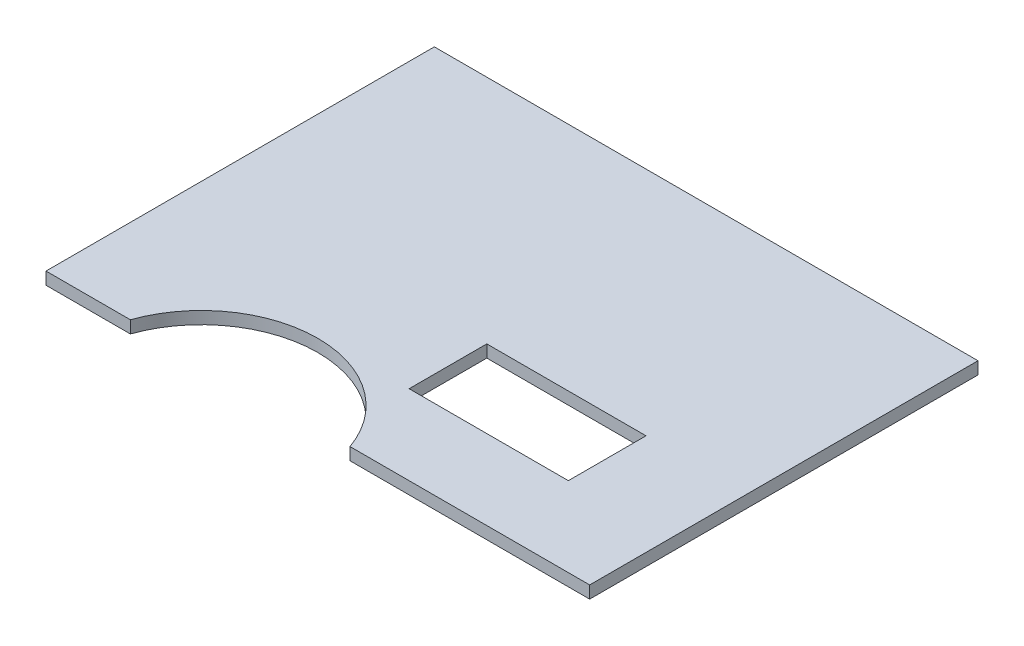
ISO-10303-21;
HEADER;
FILE_DESCRIPTION(('STEP AP214'),'2;1');
FILE_NAME('part.step','',(''),(''),'','','');
FILE_SCHEMA(('AUTOMOTIVE_DESIGN { 1 0 10303 214 1 1 1 1 }'));
ENDSEC;
DATA;
#1=APPLICATION_CONTEXT('core data for automotive mechanical design processes');
#2=APPLICATION_PROTOCOL_DEFINITION('international standard','automotive_design',2000,#1);
#3=PRODUCT_CONTEXT('',#1,'mechanical');
#4=PRODUCT('Part','Part','',(#3));
#5=PRODUCT_RELATED_PRODUCT_CATEGORY('part','',(#4));
#6=PRODUCT_DEFINITION_FORMATION('','',#4);
#7=PRODUCT_DEFINITION_CONTEXT('part definition',#1,'design');
#8=PRODUCT_DEFINITION('design','',#6,#7);
#9=PRODUCT_DEFINITION_SHAPE('','',#8);
#10=(LENGTH_UNIT() NAMED_UNIT(*) SI_UNIT(.MILLI.,.METRE.));
#11=(NAMED_UNIT(*) PLANE_ANGLE_UNIT() SI_UNIT($,.RADIAN.));
#12=(NAMED_UNIT(*) SI_UNIT($,.STERADIAN.) SOLID_ANGLE_UNIT());
#13=UNCERTAINTY_MEASURE_WITH_UNIT(LENGTH_MEASURE(1.E-05),#10,'distance_accuracy_value','');
#14=(GEOMETRIC_REPRESENTATION_CONTEXT(3) GLOBAL_UNCERTAINTY_ASSIGNED_CONTEXT((#13)) GLOBAL_UNIT_ASSIGNED_CONTEXT((#10,
#11,#12)) REPRESENTATION_CONTEXT('',''));
#15=CARTESIAN_POINT('',(0.,0.,0.));
#16=DIRECTION('',(0.,0.,1.));
#17=DIRECTION('',(1.,0.,0.));
#18=AXIS2_PLACEMENT_3D('',#15,#16,#17);
#19=CARTESIAN_POINT('',(0.,3.175,0.));
#20=DIRECTION('',(0.,0.,-1.));
#21=DIRECTION('',(-1.,0.,0.));
#22=AXIS2_PLACEMENT_3D('',#19,#20,#21);
#23=PLANE('',#22);
#24=DIRECTION('',(1.,0.,0.));
#25=VECTOR('',#24,1.);
#26=CARTESIAN_POINT('',(0.,0.,0.));
#27=LINE('',#26,#25);
#28=CARTESIAN_POINT('',(0.,0.,0.));
#29=VERTEX_POINT('',#28);
#30=CARTESIAN_POINT('',(21.7157287525381,0.,0.));
#31=VERTEX_POINT('',#30);
#32=EDGE_CURVE('E144',#29,#31,#27,.T.);
#33=ORIENTED_EDGE('',*,*,#32,.T.);
#34=DIRECTION('',(0.,1.,0.));
#35=VECTOR('',#34,1.);
#36=CARTESIAN_POINT('',(21.7157287525381,-6.825,0.));
#37=LINE('',#36,#35);
#38=CARTESIAN_POINT('',(21.7157287525381,3.175,0.));
#39=VERTEX_POINT('',#38);
#40=EDGE_CURVE('E47',#31,#39,#37,.T.);
#41=ORIENTED_EDGE('',*,*,#40,.T.);
#42=DIRECTION('',(1.,0.,0.));
#43=VECTOR('',#42,1.);
#44=CARTESIAN_POINT('',(0.,3.175,0.));
#45=LINE('',#44,#43);
#46=CARTESIAN_POINT('',(0.,3.175,0.));
#47=VERTEX_POINT('',#46);
#48=EDGE_CURVE('E122',#47,#39,#45,.T.);
#49=ORIENTED_EDGE('',*,*,#48,.F.);
#50=DIRECTION('',(0.,-1.,0.));
#51=VECTOR('',#50,1.);
#52=CARTESIAN_POINT('',(0.,3.175,0.));
#53=LINE('',#52,#51);
#54=EDGE_CURVE('E156',#47,#29,#53,.T.);
#55=ORIENTED_EDGE('',*,*,#54,.T.);
#56=EDGE_LOOP('',(#33,#41,#49,#55));
#57=FACE_BOUND('',#56,.T.);
#58=ADVANCED_FACE('F33',(#57),#23,.F.);
#59=CARTESIAN_POINT('',(0.,3.175,0.));
#60=DIRECTION('',(1.,0.,0.));
#61=DIRECTION('',(0.,0.,-1.));
#62=AXIS2_PLACEMENT_3D('',#59,#60,#61);
#63=PLANE('',#62);
#64=DIRECTION('',(0.,0.,1.));
#65=VECTOR('',#64,1.);
#66=CARTESIAN_POINT('',(0.,0.,0.));
#67=LINE('',#66,#65);
#68=CARTESIAN_POINT('',(0.,0.,-100.));
#69=VERTEX_POINT('',#68);
#70=EDGE_CURVE('E139',#69,#29,#67,.T.);
#71=ORIENTED_EDGE('',*,*,#70,.T.);
#72=ORIENTED_EDGE('',*,*,#54,.F.);
#73=DIRECTION('',(0.,0.,1.));
#74=VECTOR('',#73,1.);
#75=CARTESIAN_POINT('',(0.,3.175,0.));
#76=LINE('',#75,#74);
#77=CARTESIAN_POINT('',(0.,3.175,-100.));
#78=VERTEX_POINT('',#77);
#79=EDGE_CURVE('E128',#78,#47,#76,.T.);
#80=ORIENTED_EDGE('',*,*,#79,.F.);
#81=DIRECTION('',(0.,-1.,0.));
#82=VECTOR('',#81,1.);
#83=CARTESIAN_POINT('',(0.,3.175,-100.));
#84=LINE('',#83,#82);
#85=EDGE_CURVE('E138',#78,#69,#84,.T.);
#86=ORIENTED_EDGE('',*,*,#85,.T.);
#87=EDGE_LOOP('',(#71,#72,#80,#86));
#88=FACE_BOUND('',#87,.T.);
#89=ADVANCED_FACE('F35',(#88),#63,.F.);
#90=CARTESIAN_POINT('',(78.2842712474619,3.175,0.));
#91=VERTEX_POINT('',#90);
#92=CARTESIAN_POINT('',(140.,3.175,0.));
#93=VERTEX_POINT('',#92);
#94=EDGE_CURVE('E119',#91,#93,#45,.T.);
#95=ORIENTED_EDGE('',*,*,#94,.F.);
#96=DIRECTION('',(0.,1.,0.));
#97=VECTOR('',#96,1.);
#98=CARTESIAN_POINT('',(78.2842712474619,-6.825,0.));
#99=LINE('',#98,#97);
#100=CARTESIAN_POINT('',(78.2842712474619,0.,0.));
#101=VERTEX_POINT('',#100);
#102=EDGE_CURVE('E108',#91,#101,#99,.F.);
#103=ORIENTED_EDGE('',*,*,#102,.T.);
#104=CARTESIAN_POINT('',(140.,0.,0.));
#105=VERTEX_POINT('',#104);
#106=EDGE_CURVE('E142',#101,#105,#27,.T.);
#107=ORIENTED_EDGE('',*,*,#106,.T.);
#108=DIRECTION('',(0.,-1.,0.));
#109=VECTOR('',#108,1.);
#110=CARTESIAN_POINT('',(140.,3.175,0.));
#111=LINE('',#110,#109);
#112=EDGE_CURVE('E126',#93,#105,#111,.T.);
#113=ORIENTED_EDGE('',*,*,#112,.F.);
#114=EDGE_LOOP('',(#95,#103,#107,#113));
#115=FACE_BOUND('',#114,.T.);
#116=ADVANCED_FACE('F124',(#115),#23,.F.);
#117=CARTESIAN_POINT('',(140.,3.175,0.));
#118=DIRECTION('',(-1.,0.,0.));
#119=DIRECTION('',(0.,0.,1.));
#120=AXIS2_PLACEMENT_3D('',#117,#118,#119);
#121=PLANE('',#120);
#122=DIRECTION('',(0.,0.,-1.));
#123=VECTOR('',#122,1.);
#124=CARTESIAN_POINT('',(140.,0.,0.));
#125=LINE('',#124,#123);
#126=CARTESIAN_POINT('',(140.,0.,-100.));
#127=VERTEX_POINT('',#126);
#128=EDGE_CURVE('E147',#105,#127,#125,.T.);
#129=ORIENTED_EDGE('',*,*,#128,.T.);
#130=DIRECTION('',(0.,-1.,0.));
#131=VECTOR('',#130,1.);
#132=CARTESIAN_POINT('',(140.,3.175,-100.));
#133=LINE('',#132,#131);
#134=CARTESIAN_POINT('',(140.,3.175,-100.));
#135=VERTEX_POINT('',#134);
#136=EDGE_CURVE('E152',#135,#127,#133,.T.);
#137=ORIENTED_EDGE('',*,*,#136,.F.);
#138=DIRECTION('',(0.,0.,-1.));
#139=VECTOR('',#138,1.);
#140=CARTESIAN_POINT('',(140.,3.175,0.));
#141=LINE('',#140,#139);
#142=EDGE_CURVE('E130',#93,#135,#141,.T.);
#143=ORIENTED_EDGE('',*,*,#142,.F.);
#144=ORIENTED_EDGE('',*,*,#112,.T.);
#145=EDGE_LOOP('',(#129,#137,#143,#144));
#146=FACE_BOUND('',#145,.T.);
#147=ADVANCED_FACE('F206',(#146),#121,.F.);
#148=CARTESIAN_POINT('',(0.,3.175,-100.));
#149=DIRECTION('',(0.,0.,1.));
#150=DIRECTION('',(1.,0.,0.));
#151=AXIS2_PLACEMENT_3D('',#148,#149,#150);
#152=PLANE('',#151);
#153=DIRECTION('',(-1.,0.,0.));
#154=VECTOR('',#153,1.);
#155=CARTESIAN_POINT('',(0.,0.,-100.));
#156=LINE('',#155,#154);
#157=EDGE_CURVE('E131',#127,#69,#156,.T.);
#158=ORIENTED_EDGE('',*,*,#157,.T.);
#159=ORIENTED_EDGE('',*,*,#85,.F.);
#160=DIRECTION('',(-1.,0.,0.));
#161=VECTOR('',#160,1.);
#162=CARTESIAN_POINT('',(0.,3.175,-100.));
#163=LINE('',#162,#161);
#164=EDGE_CURVE('E136',#135,#78,#163,.T.);
#165=ORIENTED_EDGE('',*,*,#164,.F.);
#166=ORIENTED_EDGE('',*,*,#136,.T.);
#167=EDGE_LOOP('',(#158,#159,#165,#166));
#168=FACE_BOUND('',#167,.T.);
#169=ADVANCED_FACE('F212',(#168),#152,.F.);
#170=CARTESIAN_POINT('',(0.,3.175,0.));
#171=DIRECTION('',(0.,-1.,0.));
#172=DIRECTION('',(0.,0.,-1.));
#173=AXIS2_PLACEMENT_3D('',#170,#171,#172);
#174=PLANE('',#173);
#175=DIRECTION('',(1.,0.,0.));
#176=VECTOR('',#175,1.);
#177=CARTESIAN_POINT('',(73.,3.175,-20.51));
#178=LINE('',#177,#176);
#179=CARTESIAN_POINT('',(73.,3.175,-20.51));
#180=VERTEX_POINT('',#179);
#181=CARTESIAN_POINT('',(114.,3.175,-20.51));
#182=VERTEX_POINT('',#181);
#183=EDGE_CURVE('E194',#180,#182,#178,.T.);
#184=ORIENTED_EDGE('',*,*,#183,.F.);
#185=DIRECTION('',(0.,0.,1.));
#186=VECTOR('',#185,1.);
#187=CARTESIAN_POINT('',(73.,3.175,-40.51));
#188=LINE('',#187,#186);
#189=CARTESIAN_POINT('',(73.,3.175,-40.51));
#190=VERTEX_POINT('',#189);
#191=EDGE_CURVE('E55',#190,#180,#188,.T.);
#192=ORIENTED_EDGE('',*,*,#191,.F.);
#193=DIRECTION('',(-1.,0.,0.));
#194=VECTOR('',#193,1.);
#195=CARTESIAN_POINT('',(73.,3.175,-40.51));
#196=LINE('',#195,#194);
#197=CARTESIAN_POINT('',(114.,3.175,-40.51));
#198=VERTEX_POINT('',#197);
#199=EDGE_CURVE('E177',#198,#190,#196,.T.);
#200=ORIENTED_EDGE('',*,*,#199,.F.);
#201=DIRECTION('',(0.,0.,-1.));
#202=VECTOR('',#201,1.);
#203=CARTESIAN_POINT('',(114.,3.175,-40.51));
#204=LINE('',#203,#202);
#205=EDGE_CURVE('E188',#182,#198,#204,.T.);
#206=ORIENTED_EDGE('',*,*,#205,.F.);
#207=EDGE_LOOP('',(#184,#192,#200,#206));
#208=FACE_BOUND('',#207,.T.);
#209=ORIENTED_EDGE('',*,*,#48,.T.);
#210=CARTESIAN_POINT('',(50.,3.175,9.99999999999999));
#211=DIRECTION('',(0.,1.,0.));
#212=DIRECTION('',(0.,0.,1.));
#213=AXIS2_PLACEMENT_3D('',#210,#211,#212);
#214=CIRCLE('',#213,30.);
#215=EDGE_CURVE('E111',#91,#39,#214,.T.);
#216=ORIENTED_EDGE('',*,*,#215,.F.);
#217=ORIENTED_EDGE('',*,*,#94,.T.);
#218=ORIENTED_EDGE('',*,*,#142,.T.);
#219=ORIENTED_EDGE('',*,*,#164,.T.);
#220=ORIENTED_EDGE('',*,*,#79,.T.);
#221=EDGE_LOOP('',(#209,#216,#217,#218,#219,#220));
#222=FACE_BOUND('',#221,.T.);
#223=ADVANCED_FACE('F118',(#208,#222),#174,.F.);
#224=CARTESIAN_POINT('',(0.,0.,0.));
#225=DIRECTION('',(0.,-1.,0.));
#226=DIRECTION('',(0.,0.,-1.));
#227=AXIS2_PLACEMENT_3D('',#224,#225,#226);
#228=PLANE('',#227);
#229=CARTESIAN_POINT('',(50.,0.,9.99999999999999));
#230=DIRECTION('',(0.,-1.,0.));
#231=DIRECTION('',(0.,0.,-1.));
#232=AXIS2_PLACEMENT_3D('',#229,#230,#231);
#233=CIRCLE('',#232,30.);
#234=EDGE_CURVE('E11',#31,#101,#233,.T.);
#235=ORIENTED_EDGE('',*,*,#234,.F.);
#236=ORIENTED_EDGE('',*,*,#32,.F.);
#237=ORIENTED_EDGE('',*,*,#70,.F.);
#238=ORIENTED_EDGE('',*,*,#157,.F.);
#239=ORIENTED_EDGE('',*,*,#128,.F.);
#240=ORIENTED_EDGE('',*,*,#106,.F.);
#241=EDGE_LOOP('',(#235,#236,#237,#238,#239,#240));
#242=FACE_BOUND('',#241,.T.);
#243=DIRECTION('',(0.,0.,-1.));
#244=VECTOR('',#243,1.);
#245=CARTESIAN_POINT('',(73.,0.,0.));
#246=LINE('',#245,#244);
#247=CARTESIAN_POINT('',(73.,0.,-20.51));
#248=VERTEX_POINT('',#247);
#249=CARTESIAN_POINT('',(73.,0.,-40.51));
#250=VERTEX_POINT('',#249);
#251=EDGE_CURVE('E41',#248,#250,#246,.T.);
#252=ORIENTED_EDGE('',*,*,#251,.F.);
#253=DIRECTION('',(-1.,0.,0.));
#254=VECTOR('',#253,1.);
#255=CARTESIAN_POINT('',(0.,0.,-20.51));
#256=LINE('',#255,#254);
#257=CARTESIAN_POINT('',(114.,0.,-20.51));
#258=VERTEX_POINT('',#257);
#259=EDGE_CURVE('E159',#258,#248,#256,.T.);
#260=ORIENTED_EDGE('',*,*,#259,.F.);
#261=DIRECTION('',(0.,0.,1.));
#262=VECTOR('',#261,1.);
#263=CARTESIAN_POINT('',(114.,0.,0.));
#264=LINE('',#263,#262);
#265=CARTESIAN_POINT('',(114.,0.,-40.51));
#266=VERTEX_POINT('',#265);
#267=EDGE_CURVE('E161',#266,#258,#264,.T.);
#268=ORIENTED_EDGE('',*,*,#267,.F.);
#269=DIRECTION('',(1.,0.,0.));
#270=VECTOR('',#269,1.);
#271=CARTESIAN_POINT('',(0.,0.,-40.51));
#272=LINE('',#271,#270);
#273=EDGE_CURVE('E164',#250,#266,#272,.T.);
#274=ORIENTED_EDGE('',*,*,#273,.F.);
#275=EDGE_LOOP('',(#252,#260,#268,#274));
#276=FACE_BOUND('',#275,.T.);
#277=ADVANCED_FACE('F181',(#242,#276),#228,.T.);
#278=CARTESIAN_POINT('',(73.,-6.825,-40.51));
#279=DIRECTION('',(-1.,0.,0.));
#280=DIRECTION('',(0.,0.,1.));
#281=AXIS2_PLACEMENT_3D('',#278,#279,#280);
#282=PLANE('',#281);
#283=ORIENTED_EDGE('',*,*,#251,.T.);
#284=DIRECTION('',(0.,1.,0.));
#285=VECTOR('',#284,1.);
#286=CARTESIAN_POINT('',(73.,-6.825,-40.51));
#287=LINE('',#286,#285);
#288=EDGE_CURVE('E143',#250,#190,#287,.T.);
#289=ORIENTED_EDGE('',*,*,#288,.T.);
#290=ORIENTED_EDGE('',*,*,#191,.T.);
#291=DIRECTION('',(0.,1.,0.));
#292=VECTOR('',#291,1.);
#293=CARTESIAN_POINT('',(73.,-6.825,-20.51));
#294=LINE('',#293,#292);
#295=EDGE_CURVE('E169',#248,#180,#294,.T.);
#296=ORIENTED_EDGE('',*,*,#295,.F.);
#297=EDGE_LOOP('',(#283,#289,#290,#296));
#298=FACE_BOUND('',#297,.T.);
#299=ADVANCED_FACE('F167',(#298),#282,.F.);
#300=CARTESIAN_POINT('',(73.,-6.825,-40.51));
#301=DIRECTION('',(0.,0.,-1.));
#302=DIRECTION('',(-1.,0.,0.));
#303=AXIS2_PLACEMENT_3D('',#300,#301,#302);
#304=PLANE('',#303);
#305=ORIENTED_EDGE('',*,*,#273,.T.);
#306=DIRECTION('',(0.,1.,0.));
#307=VECTOR('',#306,1.);
#308=CARTESIAN_POINT('',(114.,-6.825,-40.51));
#309=LINE('',#308,#307);
#310=EDGE_CURVE('E178',#266,#198,#309,.T.);
#311=ORIENTED_EDGE('',*,*,#310,.T.);
#312=ORIENTED_EDGE('',*,*,#199,.T.);
#313=ORIENTED_EDGE('',*,*,#288,.F.);
#314=EDGE_LOOP('',(#305,#311,#312,#313));
#315=FACE_BOUND('',#314,.T.);
#316=ADVANCED_FACE('F174',(#315),#304,.F.);
#317=CARTESIAN_POINT('',(114.,-6.825,-40.51));
#318=DIRECTION('',(1.,0.,0.));
#319=DIRECTION('',(0.,0.,-1.));
#320=AXIS2_PLACEMENT_3D('',#317,#318,#319);
#321=PLANE('',#320);
#322=ORIENTED_EDGE('',*,*,#267,.T.);
#323=DIRECTION('',(0.,1.,0.));
#324=VECTOR('',#323,1.);
#325=CARTESIAN_POINT('',(114.,-6.825,-20.51));
#326=LINE('',#325,#324);
#327=EDGE_CURVE('E185',#258,#182,#326,.T.);
#328=ORIENTED_EDGE('',*,*,#327,.T.);
#329=ORIENTED_EDGE('',*,*,#205,.T.);
#330=ORIENTED_EDGE('',*,*,#310,.F.);
#331=EDGE_LOOP('',(#322,#328,#329,#330));
#332=FACE_BOUND('',#331,.T.);
#333=ADVANCED_FACE('F183',(#332),#321,.F.);
#334=CARTESIAN_POINT('',(73.,-6.825,-20.51));
#335=DIRECTION('',(0.,0.,1.));
#336=DIRECTION('',(1.,0.,0.));
#337=AXIS2_PLACEMENT_3D('',#334,#335,#336);
#338=PLANE('',#337);
#339=ORIENTED_EDGE('',*,*,#259,.T.);
#340=ORIENTED_EDGE('',*,*,#295,.T.);
#341=ORIENTED_EDGE('',*,*,#183,.T.);
#342=ORIENTED_EDGE('',*,*,#327,.F.);
#343=EDGE_LOOP('',(#339,#340,#341,#342));
#344=FACE_BOUND('',#343,.T.);
#345=ADVANCED_FACE('F233',(#344),#338,.F.);
#346=CARTESIAN_POINT('',(50.,-6.825,9.99999999999999));
#347=DIRECTION('',(0.,1.,0.));
#348=DIRECTION('',(0.,0.,1.));
#349=AXIS2_PLACEMENT_3D('',#346,#347,#348);
#350=CYLINDRICAL_SURFACE('',#349,30.);
#351=ORIENTED_EDGE('',*,*,#234,.T.);
#352=ORIENTED_EDGE('',*,*,#102,.F.);
#353=ORIENTED_EDGE('',*,*,#215,.T.);
#354=ORIENTED_EDGE('',*,*,#40,.F.);
#355=EDGE_LOOP('',(#351,#352,#353,#354));
#356=FACE_BOUND('',#355,.T.);
#357=ADVANCED_FACE('F110',(#356),#350,.F.);
#358=CLOSED_SHELL('',(#58,#89,#116,#147,#169,#223,#277,#299,#316,#333,#345,#357));
#359=MANIFOLD_SOLID_BREP('B2',#358);
#360=ADVANCED_BREP_SHAPE_REPRESENTATION('',(#18,#359),#14);
#361=SHAPE_DEFINITION_REPRESENTATION(#9,#360);
ENDSEC;
END-ISO-10303-21;
